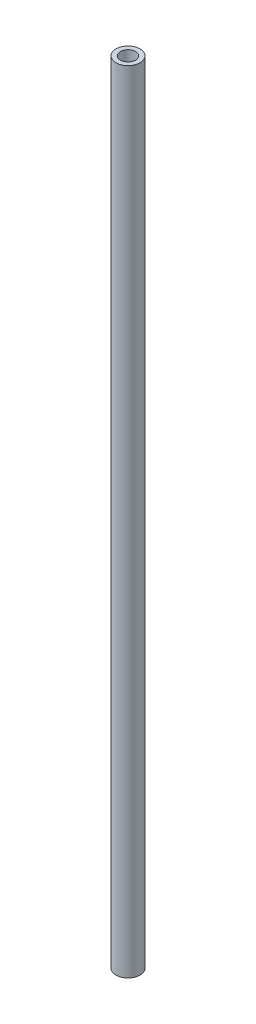
ISO-10303-21;
HEADER;
FILE_DESCRIPTION(('STEP AP214'),'2;1');
FILE_NAME('part.step','',(''),(''),'','','');
FILE_SCHEMA(('AUTOMOTIVE_DESIGN { 1 0 10303 214 1 1 1 1 }'));
ENDSEC;
DATA;
#1=APPLICATION_CONTEXT('core data for automotive mechanical design processes');
#2=APPLICATION_PROTOCOL_DEFINITION('international standard','automotive_design',2000,#1);
#3=PRODUCT_CONTEXT('',#1,'mechanical');
#4=PRODUCT('Part','Part','',(#3));
#5=PRODUCT_RELATED_PRODUCT_CATEGORY('part','',(#4));
#6=PRODUCT_DEFINITION_FORMATION('','',#4);
#7=PRODUCT_DEFINITION_CONTEXT('part definition',#1,'design');
#8=PRODUCT_DEFINITION('design','',#6,#7);
#9=PRODUCT_DEFINITION_SHAPE('','',#8);
#10=(LENGTH_UNIT() NAMED_UNIT(*) SI_UNIT(.MILLI.,.METRE.));
#11=(NAMED_UNIT(*) PLANE_ANGLE_UNIT() SI_UNIT($,.RADIAN.));
#12=(NAMED_UNIT(*) SI_UNIT($,.STERADIAN.) SOLID_ANGLE_UNIT());
#13=UNCERTAINTY_MEASURE_WITH_UNIT(LENGTH_MEASURE(1.E-05),#10,'distance_accuracy_value','');
#14=(GEOMETRIC_REPRESENTATION_CONTEXT(3) GLOBAL_UNCERTAINTY_ASSIGNED_CONTEXT((#13)) GLOBAL_UNIT_ASSIGNED_CONTEXT((#10,
#11,#12)) REPRESENTATION_CONTEXT('',''));
#15=CARTESIAN_POINT('',(0.,0.,0.));
#16=DIRECTION('',(0.,0.,1.));
#17=DIRECTION('',(1.,0.,0.));
#18=AXIS2_PLACEMENT_3D('',#15,#16,#17);
#19=CARTESIAN_POINT('',(0.,394.,0.));
#20=DIRECTION('',(0.,-1.,0.));
#21=DIRECTION('',(0.,0.,-1.));
#22=AXIS2_PLACEMENT_3D('',#19,#20,#21);
#23=CYLINDRICAL_SURFACE('',#22,6.);
#24=CARTESIAN_POINT('',(0.,394.,0.));
#25=DIRECTION('',(0.,1.,0.));
#26=DIRECTION('',(0.,0.,1.));
#27=AXIS2_PLACEMENT_3D('',#24,#25,#26);
#28=CIRCLE('',#27,6.);
#29=CARTESIAN_POINT('',(0.,394.,6.));
#30=VERTEX_POINT('',#29);
#31=EDGE_CURVE('E11',#30,#30,#28,.T.);
#32=ORIENTED_EDGE('',*,*,#31,.F.);
#33=EDGE_LOOP('',(#32));
#34=FACE_BOUND('',#33,.T.);
#35=CARTESIAN_POINT('',(0.,0.,0.));
#36=DIRECTION('',(0.,1.,0.));
#37=DIRECTION('',(0.,0.,1.));
#38=AXIS2_PLACEMENT_3D('',#35,#36,#37);
#39=CIRCLE('',#38,6.);
#40=CARTESIAN_POINT('',(0.,0.,6.));
#41=VERTEX_POINT('',#40);
#42=EDGE_CURVE('E20',#41,#41,#39,.T.);
#43=ORIENTED_EDGE('',*,*,#42,.T.);
#44=EDGE_LOOP('',(#43));
#45=FACE_BOUND('',#44,.T.);
#46=ADVANCED_FACE('F17',(#34,#45),#23,.T.);
#47=CARTESIAN_POINT('',(0.,394.,0.));
#48=DIRECTION('',(0.,1.,0.));
#49=DIRECTION('',(0.,0.,1.));
#50=AXIS2_PLACEMENT_3D('',#47,#48,#49);
#51=PLANE('',#50);
#52=CARTESIAN_POINT('',(0.,394.,0.));
#53=DIRECTION('',(0.,1.,0.));
#54=DIRECTION('',(0.,0.,1.));
#55=AXIS2_PLACEMENT_3D('',#52,#53,#54);
#56=CIRCLE('',#55,3.75);
#57=CARTESIAN_POINT('',(0.,394.,3.75));
#58=VERTEX_POINT('',#57);
#59=EDGE_CURVE('E40',#58,#58,#56,.T.);
#60=ORIENTED_EDGE('',*,*,#59,.F.);
#61=EDGE_LOOP('',(#60));
#62=FACE_BOUND('',#61,.T.);
#63=ORIENTED_EDGE('',*,*,#31,.T.);
#64=EDGE_LOOP('',(#63));
#65=FACE_BOUND('',#64,.T.);
#66=ADVANCED_FACE('F59',(#62,#65),#51,.T.);
#67=CARTESIAN_POINT('',(0.,0.,0.));
#68=DIRECTION('',(0.,1.,0.));
#69=DIRECTION('',(0.,0.,1.));
#70=AXIS2_PLACEMENT_3D('',#67,#68,#69);
#71=PLANE('',#70);
#72=CARTESIAN_POINT('',(0.,0.,0.));
#73=DIRECTION('',(0.,-1.,0.));
#74=DIRECTION('',(0.,0.,-1.));
#75=AXIS2_PLACEMENT_3D('',#72,#73,#74);
#76=CIRCLE('',#75,3.75);
#77=CARTESIAN_POINT('',(0.,0.,-3.75));
#78=VERTEX_POINT('',#77);
#79=EDGE_CURVE('E41',#78,#78,#76,.T.);
#80=ORIENTED_EDGE('',*,*,#79,.F.);
#81=EDGE_LOOP('',(#80));
#82=FACE_BOUND('',#81,.T.);
#83=ORIENTED_EDGE('',*,*,#42,.F.);
#84=EDGE_LOOP('',(#83));
#85=FACE_BOUND('',#84,.T.);
#86=ADVANCED_FACE('F56',(#82,#85),#71,.F.);
#87=CARTESIAN_POINT('',(0.,382.,0.));
#88=DIRECTION('',(0.,1.,0.));
#89=DIRECTION('',(0.,0.,1.));
#90=AXIS2_PLACEMENT_3D('',#87,#88,#89);
#91=CONICAL_SURFACE('',#90,3.75,1.02974425867665);
#92=CARTESIAN_POINT('',(0.,379.746772678646,0.));
#93=VERTEX_POINT('',#92);
#94=VERTEX_LOOP('',#93);
#95=FACE_BOUND('',#94,.T.);
#96=CARTESIAN_POINT('',(0.,382.,0.));
#97=DIRECTION('',(0.,1.,0.));
#98=DIRECTION('',(0.,0.,1.));
#99=AXIS2_PLACEMENT_3D('',#96,#97,#98);
#100=CIRCLE('',#99,3.75);
#101=CARTESIAN_POINT('',(0.,382.,3.75));
#102=VERTEX_POINT('',#101);
#103=EDGE_CURVE('E44',#102,#102,#100,.T.);
#104=ORIENTED_EDGE('',*,*,#103,.T.);
#105=EDGE_LOOP('',(#104));
#106=FACE_BOUND('',#105,.T.);
#107=ADVANCED_FACE('F58',(#95,#106),#91,.F.);
#108=CARTESIAN_POINT('',(0.,394.,0.));
#109=DIRECTION('',(0.,1.,0.));
#110=DIRECTION('',(0.,0.,1.));
#111=AXIS2_PLACEMENT_3D('',#108,#109,#110);
#112=CYLINDRICAL_SURFACE('',#111,3.75);
#113=ORIENTED_EDGE('',*,*,#103,.F.);
#114=EDGE_LOOP('',(#113));
#115=FACE_BOUND('',#114,.T.);
#116=ORIENTED_EDGE('',*,*,#59,.T.);
#117=EDGE_LOOP('',(#116));
#118=FACE_BOUND('',#117,.T.);
#119=ADVANCED_FACE('F34',(#115,#118),#112,.F.);
#120=CARTESIAN_POINT('',(0.,12.,0.));
#121=DIRECTION('',(0.,-1.,0.));
#122=DIRECTION('',(0.,0.,-1.));
#123=AXIS2_PLACEMENT_3D('',#120,#121,#122);
#124=CONICAL_SURFACE('',#123,3.75,1.02974425867665);
#125=CARTESIAN_POINT('',(0.,14.2532273213533,0.));
#126=VERTEX_POINT('',#125);
#127=VERTEX_LOOP('',#126);
#128=FACE_BOUND('',#127,.T.);
#129=CARTESIAN_POINT('',(0.,12.,0.));
#130=DIRECTION('',(0.,-1.,0.));
#131=DIRECTION('',(0.,0.,-1.));
#132=AXIS2_PLACEMENT_3D('',#129,#130,#131);
#133=CIRCLE('',#132,3.75);
#134=CARTESIAN_POINT('',(0.,12.,-3.75));
#135=VERTEX_POINT('',#134);
#136=EDGE_CURVE('E38',#135,#135,#133,.T.);
#137=ORIENTED_EDGE('',*,*,#136,.T.);
#138=EDGE_LOOP('',(#137));
#139=FACE_BOUND('',#138,.T.);
#140=ADVANCED_FACE('F30',(#128,#139),#124,.F.);
#141=CARTESIAN_POINT('',(0.,0.,0.));
#142=DIRECTION('',(0.,-1.,0.));
#143=DIRECTION('',(0.,0.,-1.));
#144=AXIS2_PLACEMENT_3D('',#141,#142,#143);
#145=CYLINDRICAL_SURFACE('',#144,3.75);
#146=ORIENTED_EDGE('',*,*,#136,.F.);
#147=EDGE_LOOP('',(#146));
#148=FACE_BOUND('',#147,.T.);
#149=ORIENTED_EDGE('',*,*,#79,.T.);
#150=EDGE_LOOP('',(#149));
#151=FACE_BOUND('',#150,.T.);
#152=ADVANCED_FACE('F33',(#148,#151),#145,.F.);
#153=CLOSED_SHELL('',(#46,#66,#86,#107,#119,#140,#152));
#154=MANIFOLD_SOLID_BREP('B1',#153);
#155=ADVANCED_BREP_SHAPE_REPRESENTATION('',(#18,#154),#14);
#156=SHAPE_DEFINITION_REPRESENTATION(#9,#155);
ENDSEC;
END-ISO-10303-21;
